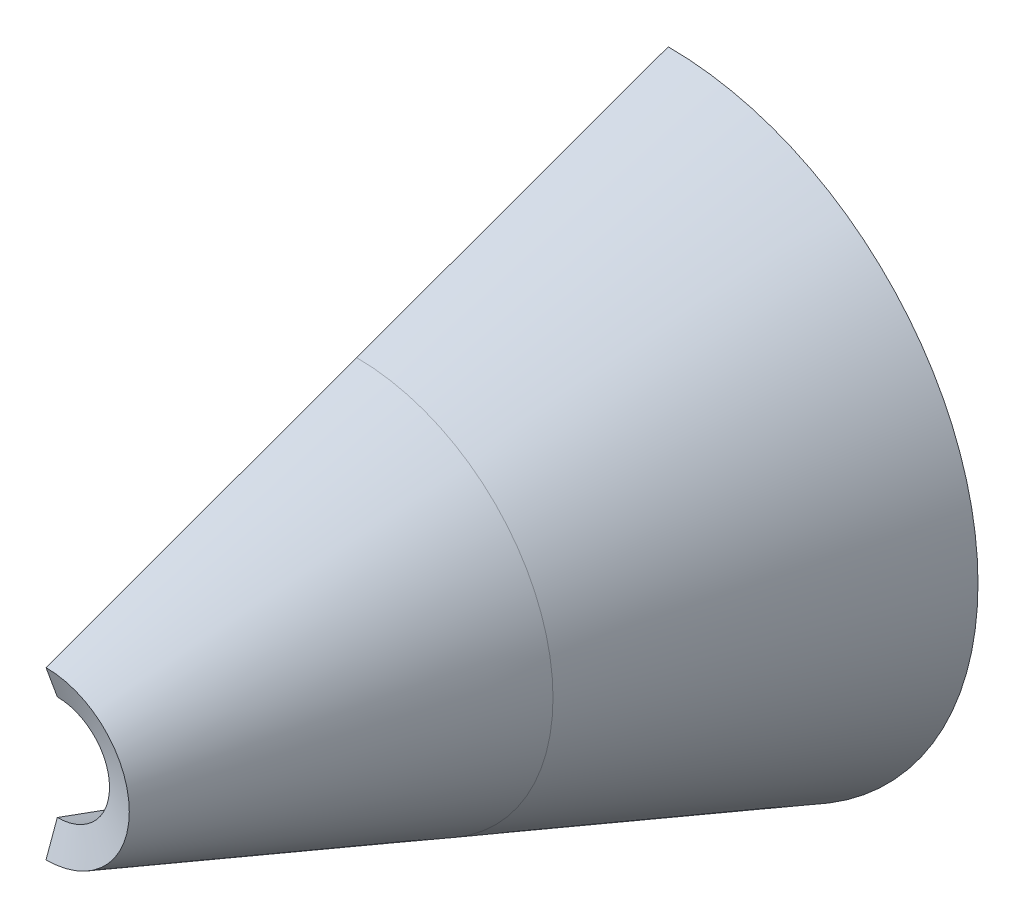
ISO-10303-21;
HEADER;
FILE_DESCRIPTION(('STEP AP214'),'2;1');
FILE_NAME('part.step','',(''),(''),'','','');
FILE_SCHEMA(('AUTOMOTIVE_DESIGN { 1 0 10303 214 1 1 1 1 }'));
ENDSEC;
DATA;
#1=APPLICATION_CONTEXT('core data for automotive mechanical design processes');
#2=APPLICATION_PROTOCOL_DEFINITION('international standard','automotive_design',2000,#1);
#3=PRODUCT_CONTEXT('',#1,'mechanical');
#4=PRODUCT('Part','Part','',(#3));
#5=PRODUCT_RELATED_PRODUCT_CATEGORY('part','',(#4));
#6=PRODUCT_DEFINITION_FORMATION('','',#4);
#7=PRODUCT_DEFINITION_CONTEXT('part definition',#1,'design');
#8=PRODUCT_DEFINITION('design','',#6,#7);
#9=PRODUCT_DEFINITION_SHAPE('','',#8);
#10=(LENGTH_UNIT() NAMED_UNIT(*) SI_UNIT(.MILLI.,.METRE.));
#11=(NAMED_UNIT(*) PLANE_ANGLE_UNIT() SI_UNIT($,.RADIAN.));
#12=(NAMED_UNIT(*) SI_UNIT($,.STERADIAN.) SOLID_ANGLE_UNIT());
#13=UNCERTAINTY_MEASURE_WITH_UNIT(LENGTH_MEASURE(1.E-05),#10,'distance_accuracy_value','');
#14=(GEOMETRIC_REPRESENTATION_CONTEXT(3) GLOBAL_UNCERTAINTY_ASSIGNED_CONTEXT((#13)) GLOBAL_UNIT_ASSIGNED_CONTEXT((#10,
#11,#12)) REPRESENTATION_CONTEXT('',''));
#15=CARTESIAN_POINT('',(0.,0.,0.));
#16=DIRECTION('',(0.,0.,1.));
#17=DIRECTION('',(1.,0.,0.));
#18=AXIS2_PLACEMENT_3D('',#15,#16,#17);
#19=CARTESIAN_POINT('',(0.,25.,0.));
#20=DIRECTION('',(1.,0.,0.));
#21=DIRECTION('',(0.,0.342020143325669,-0.939692620785908));
#22=AXIS2_PLACEMENT_3D('',#19,#20,#21);
#23=PLANE('',#22);
#24=DIRECTION('',(0.,0.939692620785908,0.342020143325669));
#25=VECTOR('',#24,1.);
#26=CARTESIAN_POINT('',(0.,25.,0.));
#27=LINE('',#26,#25);
#28=CARTESIAN_POINT('',(0.,25.,0.));
#29=VERTEX_POINT('',#28);
#30=CARTESIAN_POINT('',(0.,29.6984631039295,1.71010071662835));
#31=VERTEX_POINT('',#30);
#32=EDGE_CURVE('E11',#29,#31,#27,.T.);
#33=ORIENTED_EDGE('',*,*,#32,.F.);
#34=DIRECTION('',(0.,0.342020143325669,-0.939692620785908));
#35=VECTOR('',#34,1.);
#36=CARTESIAN_POINT('',(0.,25.,0.));
#37=LINE('',#36,#35);
#38=CARTESIAN_POINT('',(0.,7.89899283371653,46.9846310392954));
#39=VERTEX_POINT('',#38);
#40=EDGE_CURVE('E124',#39,#29,#37,.T.);
#41=ORIENTED_EDGE('',*,*,#40,.F.);
#42=DIRECTION('',(0.,0.939692620785908,0.342020143325669));
#43=VECTOR('',#42,1.);
#44=CARTESIAN_POINT('',(0.,7.89899283371653,46.9846310392954));
#45=LINE('',#44,#43);
#46=CARTESIAN_POINT('',(0.,12.5974559376461,48.6947317559238));
#47=VERTEX_POINT('',#46);
#48=EDGE_CURVE('E49',#39,#47,#45,.T.);
#49=ORIENTED_EDGE('',*,*,#48,.T.);
#50=DIRECTION('',(0.,0.342020143325669,-0.939692620785908));
#51=VECTOR('',#50,1.);
#52=CARTESIAN_POINT('',(0.,12.5974559376461,48.6947317559237));
#53=LINE('',#52,#51);
#54=EDGE_CURVE('E121',#47,#31,#53,.T.);
#55=ORIENTED_EDGE('',*,*,#54,.T.);
#56=EDGE_LOOP('',(#33,#41,#49,#55));
#57=FACE_BOUND('',#56,.T.);
#58=ADVANCED_FACE('F39',(#57),#23,.F.);
#59=CARTESIAN_POINT('',(0.,0.,46.9846310392954));
#60=DIRECTION('',(0.,0.,1.));
#61=DIRECTION('',(1.,0.,0.));
#62=AXIS2_PLACEMENT_3D('',#59,#60,#61);
#63=CONICAL_SURFACE('',#62,7.89899283371653,1.22173047639603);
#64=ORIENTED_EDGE('',*,*,#48,.F.);
#65=CARTESIAN_POINT('',(0.,0.,46.9846310392954));
#66=DIRECTION('',(0.,0.,1.));
#67=DIRECTION('',(0.,-1.,0.));
#68=AXIS2_PLACEMENT_3D('',#65,#66,#67);
#69=CIRCLE('',#68,7.89899283371653);
#70=CARTESIAN_POINT('',(0.,-7.89899283371653,46.9846310392954));
#71=VERTEX_POINT('',#70);
#72=EDGE_CURVE('E97',#71,#39,#69,.T.);
#73=ORIENTED_EDGE('',*,*,#72,.F.);
#74=DIRECTION('',(0.,-0.939692620785908,0.342020143325669));
#75=VECTOR('',#74,1.);
#76=CARTESIAN_POINT('',(0.,-7.89899283371653,46.9846310392954));
#77=LINE('',#76,#75);
#78=CARTESIAN_POINT('',(0.,-12.5974559376461,48.6947317559238));
#79=VERTEX_POINT('',#78);
#80=EDGE_CURVE('E113',#71,#79,#77,.T.);
#81=ORIENTED_EDGE('',*,*,#80,.T.);
#82=CARTESIAN_POINT('',(0.,0.,48.6947317559238));
#83=DIRECTION('',(0.,0.,-1.));
#84=DIRECTION('',(-1.,0.,0.));
#85=AXIS2_PLACEMENT_3D('',#82,#83,#84);
#86=CIRCLE('',#85,12.5974559376461);
#87=EDGE_CURVE('E133',#79,#47,#86,.F.);
#88=ORIENTED_EDGE('',*,*,#87,.T.);
#89=EDGE_LOOP('',(#64,#73,#81,#88));
#90=FACE_BOUND('',#89,.T.);
#91=ADVANCED_FACE('F138',(#90),#63,.F.);
#92=CARTESIAN_POINT('',(0.,-25.,0.));
#93=DIRECTION('',(-1.,0.,0.));
#94=DIRECTION('',(0.,-0.342020143325669,-0.939692620785908));
#95=AXIS2_PLACEMENT_3D('',#92,#93,#94);
#96=PLANE('',#95);
#97=ORIENTED_EDGE('',*,*,#80,.F.);
#98=DIRECTION('',(0.,-0.342020143325669,-0.939692620785908));
#99=VECTOR('',#98,1.);
#100=CARTESIAN_POINT('',(0.,-25.,0.));
#101=LINE('',#100,#99);
#102=CARTESIAN_POINT('',(0.,-25.,0.));
#103=VERTEX_POINT('',#102);
#104=EDGE_CURVE('E98',#71,#103,#101,.T.);
#105=ORIENTED_EDGE('',*,*,#104,.T.);
#106=DIRECTION('',(0.,-0.939692620785908,0.342020143325669));
#107=VECTOR('',#106,1.);
#108=CARTESIAN_POINT('',(0.,-25.,0.));
#109=LINE('',#108,#107);
#110=CARTESIAN_POINT('',(0.,-29.6984631039295,1.71010071662835));
#111=VERTEX_POINT('',#110);
#112=EDGE_CURVE('E87',#103,#111,#109,.T.);
#113=ORIENTED_EDGE('',*,*,#112,.T.);
#114=DIRECTION('',(0.,-0.342020143325669,-0.939692620785908));
#115=VECTOR('',#114,1.);
#116=CARTESIAN_POINT('',(0.,-12.5974559376461,48.6947317559237));
#117=LINE('',#116,#115);
#118=EDGE_CURVE('E104',#79,#111,#117,.T.);
#119=ORIENTED_EDGE('',*,*,#118,.F.);
#120=EDGE_LOOP('',(#97,#105,#113,#119));
#121=FACE_BOUND('',#120,.T.);
#122=ADVANCED_FACE('F151',(#121),#96,.T.);
#123=CARTESIAN_POINT('',(0.,-25.,0.));
#124=DIRECTION('',(-1.,0.,0.));
#125=DIRECTION('',(0.,-0.342020143325669,-0.939692620785908));
#126=AXIS2_PLACEMENT_3D('',#123,#124,#125);
#127=PLANE('',#126);
#128=ORIENTED_EDGE('',*,*,#112,.F.);
#129=DIRECTION('',(0.,-0.342020143325669,-0.939692620785908));
#130=VECTOR('',#129,1.);
#131=CARTESIAN_POINT('',(0.,-25.,0.));
#132=LINE('',#131,#130);
#133=CARTESIAN_POINT('',(0.,-42.1535005931214,-47.1288555442023));
#134=VERTEX_POINT('',#133);
#135=EDGE_CURVE('E90',#103,#134,#132,.T.);
#136=ORIENTED_EDGE('',*,*,#135,.T.);
#137=DIRECTION('',(0.,-0.939692620785908,0.342020143325669));
#138=VECTOR('',#137,1.);
#139=CARTESIAN_POINT('',(0.,-42.1535005931214,-47.1288555442023));
#140=LINE('',#139,#138);
#141=CARTESIAN_POINT('',(0.,-46.8519636970509,-45.418754827574));
#142=VERTEX_POINT('',#141);
#143=EDGE_CURVE('E76',#134,#142,#140,.T.);
#144=ORIENTED_EDGE('',*,*,#143,.T.);
#145=DIRECTION('',(0.,-0.342020143325669,-0.939692620785908));
#146=VECTOR('',#145,1.);
#147=CARTESIAN_POINT('',(0.,-29.6984631039295,1.71010071662835));
#148=LINE('',#147,#146);
#149=EDGE_CURVE('E107',#111,#142,#148,.T.);
#150=ORIENTED_EDGE('',*,*,#149,.F.);
#151=EDGE_LOOP('',(#128,#136,#144,#150));
#152=FACE_BOUND('',#151,.T.);
#153=ADVANCED_FACE('F91',(#152),#127,.T.);
#154=CARTESIAN_POINT('',(0.,0.,-47.1288555442023));
#155=DIRECTION('',(0.,0.,1.));
#156=DIRECTION('',(1.,0.,0.));
#157=AXIS2_PLACEMENT_3D('',#154,#155,#156);
#158=CONICAL_SURFACE('',#157,42.1535005931214,1.22173047639603);
#159=ORIENTED_EDGE('',*,*,#143,.F.);
#160=CARTESIAN_POINT('',(0.,0.,-47.1288555442023));
#161=DIRECTION('',(0.,0.,1.));
#162=DIRECTION('',(0.,-1.,0.));
#163=AXIS2_PLACEMENT_3D('',#160,#161,#162);
#164=CIRCLE('',#163,42.1535005931214);
#165=CARTESIAN_POINT('',(0.,42.1535005931214,-47.1288555442023));
#166=VERTEX_POINT('',#165);
#167=EDGE_CURVE('E80',#134,#166,#164,.T.);
#168=ORIENTED_EDGE('',*,*,#167,.T.);
#169=DIRECTION('',(0.,0.939692620785908,0.342020143325669));
#170=VECTOR('',#169,1.);
#171=CARTESIAN_POINT('',(0.,42.1535005931214,-47.1288555442023));
#172=LINE('',#171,#170);
#173=CARTESIAN_POINT('',(0.,46.8519636970509,-45.418754827574));
#174=VERTEX_POINT('',#173);
#175=EDGE_CURVE('E43',#166,#174,#172,.T.);
#176=ORIENTED_EDGE('',*,*,#175,.T.);
#177=CARTESIAN_POINT('',(0.,0.,-45.418754827574));
#178=DIRECTION('',(0.,0.,-1.));
#179=DIRECTION('',(-1.,0.,0.));
#180=AXIS2_PLACEMENT_3D('',#177,#178,#179);
#181=CIRCLE('',#180,46.8519636970509);
#182=EDGE_CURVE('E83',#142,#174,#181,.F.);
#183=ORIENTED_EDGE('',*,*,#182,.F.);
#184=EDGE_LOOP('',(#159,#168,#176,#183));
#185=FACE_BOUND('',#184,.T.);
#186=ADVANCED_FACE('F78',(#185),#158,.T.);
#187=CARTESIAN_POINT('',(0.,25.,0.));
#188=DIRECTION('',(1.,0.,0.));
#189=DIRECTION('',(0.,0.342020143325669,-0.939692620785908));
#190=AXIS2_PLACEMENT_3D('',#187,#188,#189);
#191=PLANE('',#190);
#192=DIRECTION('',(0.,0.342020143325669,-0.939692620785908));
#193=VECTOR('',#192,1.);
#194=CARTESIAN_POINT('',(0.,25.,0.));
#195=LINE('',#194,#193);
#196=EDGE_CURVE('E103',#29,#166,#195,.T.);
#197=ORIENTED_EDGE('',*,*,#196,.F.);
#198=ORIENTED_EDGE('',*,*,#32,.T.);
#199=DIRECTION('',(0.,0.342020143325669,-0.939692620785908));
#200=VECTOR('',#199,1.);
#201=CARTESIAN_POINT('',(0.,29.6984631039295,1.71010071662835));
#202=LINE('',#201,#200);
#203=EDGE_CURVE('E142',#31,#174,#202,.T.);
#204=ORIENTED_EDGE('',*,*,#203,.T.);
#205=ORIENTED_EDGE('',*,*,#175,.F.);
#206=EDGE_LOOP('',(#197,#198,#204,#205));
#207=FACE_BOUND('',#206,.T.);
#208=ADVANCED_FACE('F41',(#207),#191,.F.);
#209=CARTESIAN_POINT('',(0.,0.,1.71010071662835));
#210=DIRECTION('',(0.,0.,-1.));
#211=DIRECTION('',(-1.,0.,0.));
#212=AXIS2_PLACEMENT_3D('',#209,#210,#211);
#213=CONICAL_SURFACE('',#212,29.6984631039295,0.349065850398866);
#214=ORIENTED_EDGE('',*,*,#182,.T.);
#215=ORIENTED_EDGE('',*,*,#203,.F.);
#216=CARTESIAN_POINT('',(0.,0.,1.71010071662835));
#217=DIRECTION('',(0.,0.,-1.));
#218=DIRECTION('',(-1.,0.,0.));
#219=AXIS2_PLACEMENT_3D('',#216,#217,#218);
#220=CIRCLE('',#219,29.6984631039295);
#221=EDGE_CURVE('E136',#111,#31,#220,.F.);
#222=ORIENTED_EDGE('',*,*,#221,.F.);
#223=ORIENTED_EDGE('',*,*,#149,.T.);
#224=EDGE_LOOP('',(#214,#215,#222,#223));
#225=FACE_BOUND('',#224,.T.);
#226=ADVANCED_FACE('F157',(#225),#213,.T.);
#227=CARTESIAN_POINT('',(0.,0.,48.6947317559237));
#228=DIRECTION('',(0.,0.,-1.));
#229=DIRECTION('',(-1.,0.,0.));
#230=AXIS2_PLACEMENT_3D('',#227,#228,#229);
#231=CONICAL_SURFACE('',#230,12.5974559376461,0.349065850398867);
#232=ORIENTED_EDGE('',*,*,#221,.T.);
#233=ORIENTED_EDGE('',*,*,#54,.F.);
#234=ORIENTED_EDGE('',*,*,#87,.F.);
#235=ORIENTED_EDGE('',*,*,#118,.T.);
#236=EDGE_LOOP('',(#232,#233,#234,#235));
#237=FACE_BOUND('',#236,.T.);
#238=ADVANCED_FACE('F131',(#237),#231,.T.);
#239=CARTESIAN_POINT('',(0.,0.,0.));
#240=DIRECTION('',(0.,0.,-1.));
#241=DIRECTION('',(-1.,0.,0.));
#242=AXIS2_PLACEMENT_3D('',#239,#240,#241);
#243=CONICAL_SURFACE('',#242,25.,0.349065850398866);
#244=ORIENTED_EDGE('',*,*,#167,.F.);
#245=ORIENTED_EDGE('',*,*,#135,.F.);
#246=CARTESIAN_POINT('',(0.,0.,0.));
#247=DIRECTION('',(0.,0.,1.));
#248=DIRECTION('',(0.,-1.,0.));
#249=AXIS2_PLACEMENT_3D('',#246,#247,#248);
#250=CIRCLE('',#249,25.);
#251=EDGE_CURVE('E109',#103,#29,#250,.T.);
#252=ORIENTED_EDGE('',*,*,#251,.T.);
#253=ORIENTED_EDGE('',*,*,#196,.T.);
#254=EDGE_LOOP('',(#244,#245,#252,#253));
#255=FACE_BOUND('',#254,.T.);
#256=ADVANCED_FACE('F101',(#255),#243,.F.);
#257=CARTESIAN_POINT('',(0.,0.,46.9846310392954));
#258=DIRECTION('',(0.,0.,-1.));
#259=DIRECTION('',(-1.,0.,0.));
#260=AXIS2_PLACEMENT_3D('',#257,#258,#259);
#261=CONICAL_SURFACE('',#260,7.89899283371653,0.349065850398867);
#262=ORIENTED_EDGE('',*,*,#251,.F.);
#263=ORIENTED_EDGE('',*,*,#104,.F.);
#264=ORIENTED_EDGE('',*,*,#72,.T.);
#265=ORIENTED_EDGE('',*,*,#40,.T.);
#266=EDGE_LOOP('',(#262,#263,#264,#265));
#267=FACE_BOUND('',#266,.T.);
#268=ADVANCED_FACE('F149',(#267),#261,.F.);
#269=CLOSED_SHELL('',(#58,#91,#122,#153,#186,#208,#226,#238,#256,#268));
#270=MANIFOLD_SOLID_BREP('B2',#269);
#271=ADVANCED_BREP_SHAPE_REPRESENTATION('',(#18,#270),#14);
#272=SHAPE_DEFINITION_REPRESENTATION(#9,#271);
ENDSEC;
END-ISO-10303-21;
